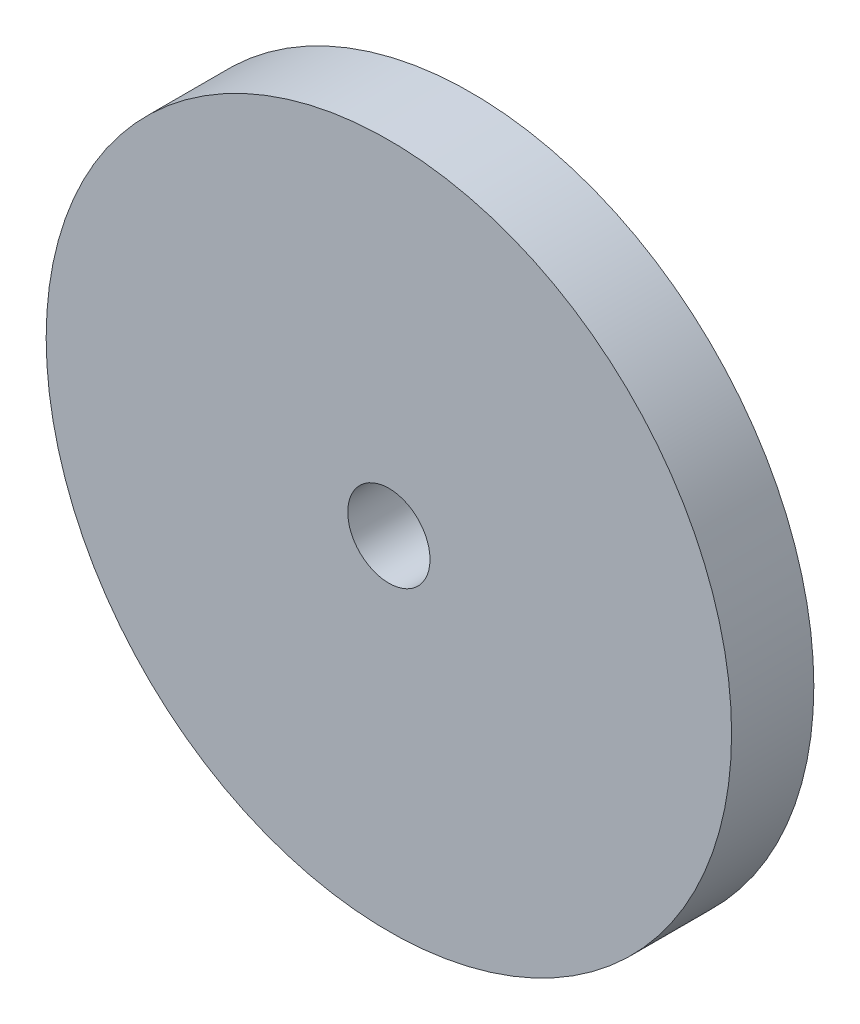
ISO-10303-21;
HEADER;
FILE_DESCRIPTION(('STEP AP214'),'2;1');
FILE_NAME('part.step','',(''),(''),'','','');
FILE_SCHEMA(('AUTOMOTIVE_DESIGN { 1 0 10303 214 1 1 1 1 }'));
ENDSEC;
DATA;
#1=APPLICATION_CONTEXT('core data for automotive mechanical design processes');
#2=APPLICATION_PROTOCOL_DEFINITION('international standard','automotive_design',2000,#1);
#3=PRODUCT_CONTEXT('',#1,'mechanical');
#4=PRODUCT('Part','Part','',(#3));
#5=PRODUCT_RELATED_PRODUCT_CATEGORY('part','',(#4));
#6=PRODUCT_DEFINITION_FORMATION('','',#4);
#7=PRODUCT_DEFINITION_CONTEXT('part definition',#1,'design');
#8=PRODUCT_DEFINITION('design','',#6,#7);
#9=PRODUCT_DEFINITION_SHAPE('','',#8);
#10=(LENGTH_UNIT() NAMED_UNIT(*) SI_UNIT(.MILLI.,.METRE.));
#11=(NAMED_UNIT(*) PLANE_ANGLE_UNIT() SI_UNIT($,.RADIAN.));
#12=(NAMED_UNIT(*) SI_UNIT($,.STERADIAN.) SOLID_ANGLE_UNIT());
#13=UNCERTAINTY_MEASURE_WITH_UNIT(LENGTH_MEASURE(1.E-05),#10,'distance_accuracy_value','');
#14=(GEOMETRIC_REPRESENTATION_CONTEXT(3) GLOBAL_UNCERTAINTY_ASSIGNED_CONTEXT((#13)) GLOBAL_UNIT_ASSIGNED_CONTEXT((#10,
#11,#12)) REPRESENTATION_CONTEXT('',''));
#15=CARTESIAN_POINT('',(0.,0.,0.));
#16=DIRECTION('',(0.,0.,1.));
#17=DIRECTION('',(1.,0.,0.));
#18=AXIS2_PLACEMENT_3D('',#15,#16,#17);
#19=CARTESIAN_POINT('',(0.,0.,3.));
#20=DIRECTION('',(0.,0.,1.));
#21=DIRECTION('',(1.,0.,0.));
#22=AXIS2_PLACEMENT_3D('',#19,#20,#21);
#23=PLANE('',#22);
#24=CARTESIAN_POINT('',(0.,0.,3.));
#25=DIRECTION('',(0.,0.,1.));
#26=DIRECTION('',(1.,0.,0.));
#27=AXIS2_PLACEMENT_3D('',#24,#25,#26);
#28=CIRCLE('',#27,12.5);
#29=CARTESIAN_POINT('',(12.5,0.,3.));
#30=VERTEX_POINT('',#29);
#31=EDGE_CURVE('E11',#30,#30,#28,.T.);
#32=ORIENTED_EDGE('',*,*,#31,.T.);
#33=EDGE_LOOP('',(#32));
#34=FACE_BOUND('',#33,.T.);
#35=CARTESIAN_POINT('',(0.,0.,3.));
#36=DIRECTION('',(0.,0.,1.));
#37=DIRECTION('',(1.,0.,0.));
#38=AXIS2_PLACEMENT_3D('',#35,#36,#37);
#39=CIRCLE('',#38,1.5);
#40=CARTESIAN_POINT('',(1.5,0.,3.));
#41=VERTEX_POINT('',#40);
#42=EDGE_CURVE('E51',#41,#41,#39,.T.);
#43=ORIENTED_EDGE('',*,*,#42,.F.);
#44=EDGE_LOOP('',(#43));
#45=FACE_BOUND('',#44,.T.);
#46=ADVANCED_FACE('F38',(#34,#45),#23,.T.);
#47=CARTESIAN_POINT('',(0.,0.,0.));
#48=DIRECTION('',(0.,0.,1.));
#49=DIRECTION('',(1.,0.,0.));
#50=AXIS2_PLACEMENT_3D('',#47,#48,#49);
#51=PLANE('',#50);
#52=CARTESIAN_POINT('',(0.,0.,0.));
#53=DIRECTION('',(0.,0.,1.));
#54=DIRECTION('',(1.,0.,0.));
#55=AXIS2_PLACEMENT_3D('',#52,#53,#54);
#56=CIRCLE('',#55,12.5);
#57=CARTESIAN_POINT('',(12.5,0.,0.));
#58=VERTEX_POINT('',#57);
#59=EDGE_CURVE('E42',#58,#58,#56,.T.);
#60=ORIENTED_EDGE('',*,*,#59,.F.);
#61=EDGE_LOOP('',(#60));
#62=FACE_BOUND('',#61,.T.);
#63=CARTESIAN_POINT('',(0.,0.,0.));
#64=DIRECTION('',(0.,0.,1.));
#65=DIRECTION('',(1.,0.,0.));
#66=AXIS2_PLACEMENT_3D('',#63,#64,#65);
#67=CIRCLE('',#66,1.5);
#68=CARTESIAN_POINT('',(1.5,0.,0.));
#69=VERTEX_POINT('',#68);
#70=EDGE_CURVE('E52',#69,#69,#67,.T.);
#71=ORIENTED_EDGE('',*,*,#70,.T.);
#72=EDGE_LOOP('',(#71));
#73=FACE_BOUND('',#72,.T.);
#74=ADVANCED_FACE('F64',(#62,#73),#51,.F.);
#75=CARTESIAN_POINT('',(0.,0.,3.));
#76=DIRECTION('',(0.,0.,-1.));
#77=DIRECTION('',(-1.,0.,0.));
#78=AXIS2_PLACEMENT_3D('',#75,#76,#77);
#79=CYLINDRICAL_SURFACE('',#78,12.5);
#80=ORIENTED_EDGE('',*,*,#31,.F.);
#81=EDGE_LOOP('',(#80));
#82=FACE_BOUND('',#81,.T.);
#83=ORIENTED_EDGE('',*,*,#59,.T.);
#84=EDGE_LOOP('',(#83));
#85=FACE_BOUND('',#84,.T.);
#86=ADVANCED_FACE('F40',(#82,#85),#79,.T.);
#87=CARTESIAN_POINT('',(0.,0.,3.));
#88=DIRECTION('',(0.,0.,-1.));
#89=DIRECTION('',(-1.,0.,0.));
#90=AXIS2_PLACEMENT_3D('',#87,#88,#89);
#91=CYLINDRICAL_SURFACE('',#90,1.5);
#92=ORIENTED_EDGE('',*,*,#42,.T.);
#93=EDGE_LOOP('',(#92));
#94=FACE_BOUND('',#93,.T.);
#95=ORIENTED_EDGE('',*,*,#70,.F.);
#96=EDGE_LOOP('',(#95));
#97=FACE_BOUND('',#96,.T.);
#98=ADVANCED_FACE('F60',(#94,#97),#91,.F.);
#99=CLOSED_SHELL('',(#46,#74,#86,#98));
#100=MANIFOLD_SOLID_BREP('B2',#99);
#101=ADVANCED_BREP_SHAPE_REPRESENTATION('',(#18,#100),#14);
#102=SHAPE_DEFINITION_REPRESENTATION(#9,#101);
ENDSEC;
END-ISO-10303-21;
